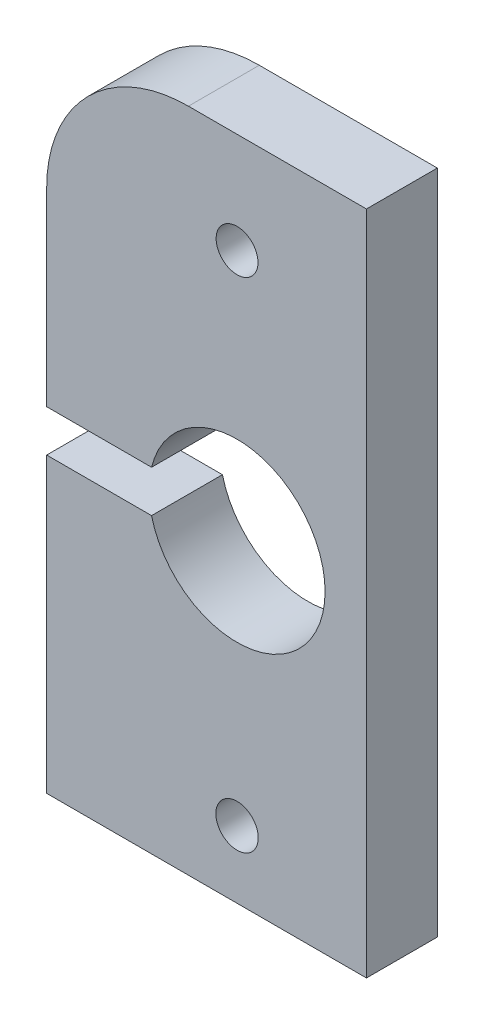
ISO-10303-21;
HEADER;
FILE_DESCRIPTION(('STEP AP214'),'2;1');
FILE_NAME('part.step','',(''),(''),'','','');
FILE_SCHEMA(('AUTOMOTIVE_DESIGN { 1 0 10303 214 1 1 1 1 }'));
ENDSEC;
DATA;
#1=APPLICATION_CONTEXT('core data for automotive mechanical design processes');
#2=APPLICATION_PROTOCOL_DEFINITION('international standard','automotive_design',2000,#1);
#3=PRODUCT_CONTEXT('',#1,'mechanical');
#4=PRODUCT('Part','Part','',(#3));
#5=PRODUCT_RELATED_PRODUCT_CATEGORY('part','',(#4));
#6=PRODUCT_DEFINITION_FORMATION('','',#4);
#7=PRODUCT_DEFINITION_CONTEXT('part definition',#1,'design');
#8=PRODUCT_DEFINITION('design','',#6,#7);
#9=PRODUCT_DEFINITION_SHAPE('','',#8);
#10=(LENGTH_UNIT() NAMED_UNIT(*) SI_UNIT(.MILLI.,.METRE.));
#11=(NAMED_UNIT(*) PLANE_ANGLE_UNIT() SI_UNIT($,.RADIAN.));
#12=(NAMED_UNIT(*) SI_UNIT($,.STERADIAN.) SOLID_ANGLE_UNIT());
#13=UNCERTAINTY_MEASURE_WITH_UNIT(LENGTH_MEASURE(1.E-05),#10,'distance_accuracy_value','');
#14=(GEOMETRIC_REPRESENTATION_CONTEXT(3) GLOBAL_UNCERTAINTY_ASSIGNED_CONTEXT((#13)) GLOBAL_UNIT_ASSIGNED_CONTEXT((#10,
#11,#12)) REPRESENTATION_CONTEXT('',''));
#15=CARTESIAN_POINT('',(0.,0.,0.));
#16=DIRECTION('',(0.,0.,1.));
#17=DIRECTION('',(1.,0.,0.));
#18=AXIS2_PLACEMENT_3D('',#15,#16,#17);
#19=CARTESIAN_POINT('',(-103.635582515292,86.8287381906903,5.08));
#20=DIRECTION('',(0.,0.,-1.));
#21=DIRECTION('',(-1.,0.,0.));
#22=AXIS2_PLACEMENT_3D('',#19,#20,#21);
#23=CYLINDRICAL_SURFACE('',#22,6.30892038834635);
#24=CARTESIAN_POINT('',(-103.635582515292,86.8287381906903,0.));
#25=DIRECTION('',(0.,0.,1.));
#26=DIRECTION('',(1.,0.,0.));
#27=AXIS2_PLACEMENT_3D('',#24,#25,#26);
#28=CIRCLE('',#27,6.30892038834635);
#29=CARTESIAN_POINT('',(-109.763590059877,85.3287381906903,0.));
#30=VERTEX_POINT('',#29);
#31=CARTESIAN_POINT('',(-109.763590059877,88.3287381906903,0.));
#32=VERTEX_POINT('',#31);
#33=EDGE_CURVE('E139',#30,#32,#28,.T.);
#34=ORIENTED_EDGE('',*,*,#33,.F.);
#35=DIRECTION('',(0.,0.,-1.));
#36=VECTOR('',#35,1.);
#37=CARTESIAN_POINT('',(-109.763590059877,85.3287381906903,5.08));
#38=LINE('',#37,#36);
#39=CARTESIAN_POINT('',(-109.763590059877,85.3287381906903,5.08));
#40=VERTEX_POINT('',#39);
#41=EDGE_CURVE('E11',#40,#30,#38,.T.);
#42=ORIENTED_EDGE('',*,*,#41,.F.);
#43=CARTESIAN_POINT('',(-103.635582515292,86.8287381906903,5.08));
#44=DIRECTION('',(0.,0.,1.));
#45=DIRECTION('',(1.,0.,0.));
#46=AXIS2_PLACEMENT_3D('',#43,#44,#45);
#47=CIRCLE('',#46,6.30892038834635);
#48=CARTESIAN_POINT('',(-109.763590059877,88.3287381906903,5.08));
#49=VERTEX_POINT('',#48);
#50=EDGE_CURVE('E168',#40,#49,#47,.T.);
#51=ORIENTED_EDGE('',*,*,#50,.T.);
#52=DIRECTION('',(0.,0.,-1.));
#53=VECTOR('',#52,1.);
#54=CARTESIAN_POINT('',(-109.763590059877,88.3287381906903,5.08));
#55=LINE('',#54,#53);
#56=EDGE_CURVE('E49',#49,#32,#55,.T.);
#57=ORIENTED_EDGE('',*,*,#56,.T.);
#58=EDGE_LOOP('',(#34,#42,#51,#57));
#59=FACE_BOUND('',#58,.T.);
#60=ADVANCED_FACE('F33',(#59),#23,.F.);
#61=CARTESIAN_POINT('',(0.,85.3287381906903,5.08));
#62=DIRECTION('',(0.,1.,0.));
#63=DIRECTION('',(0.,0.,1.));
#64=AXIS2_PLACEMENT_3D('',#61,#62,#63);
#65=PLANE('',#64);
#66=DIRECTION('',(1.,0.,0.));
#67=VECTOR('',#66,1.);
#68=CARTESIAN_POINT('',(0.,85.3287381906903,0.));
#69=LINE('',#68,#67);
#70=CARTESIAN_POINT('',(-117.281412130556,85.3287381906903,0.));
#71=VERTEX_POINT('',#70);
#72=EDGE_CURVE('E141',#71,#30,#69,.T.);
#73=ORIENTED_EDGE('',*,*,#72,.F.);
#74=DIRECTION('',(0.,0.,-1.));
#75=VECTOR('',#74,1.);
#76=CARTESIAN_POINT('',(-117.281412130556,85.3287381906903,5.08));
#77=LINE('',#76,#75);
#78=CARTESIAN_POINT('',(-117.281412130556,85.3287381906903,5.08));
#79=VERTEX_POINT('',#78);
#80=EDGE_CURVE('E41',#79,#71,#77,.T.);
#81=ORIENTED_EDGE('',*,*,#80,.F.);
#82=DIRECTION('',(1.,0.,0.));
#83=VECTOR('',#82,1.);
#84=CARTESIAN_POINT('',(0.,85.3287381906903,5.08));
#85=LINE('',#84,#83);
#86=EDGE_CURVE('E199',#79,#40,#85,.T.);
#87=ORIENTED_EDGE('',*,*,#86,.T.);
#88=ORIENTED_EDGE('',*,*,#41,.T.);
#89=EDGE_LOOP('',(#73,#81,#87,#88));
#90=FACE_BOUND('',#89,.T.);
#91=ADVANCED_FACE('F187',(#90),#65,.T.);
#92=CARTESIAN_POINT('',(-117.281412130556,-1.00755895091466E-12,5.08));
#93=DIRECTION('',(-1.,0.,0.));
#94=DIRECTION('',(0.,-1.,0.));
#95=AXIS2_PLACEMENT_3D('',#92,#93,#94);
#96=PLANE('',#95);
#97=DIRECTION('',(0.,1.,0.));
#98=VECTOR('',#97,1.);
#99=CARTESIAN_POINT('',(-117.281412130556,-1.00755895091466E-12,0.));
#100=LINE('',#99,#98);
#101=CARTESIAN_POINT('',(-117.281412130556,64.3285920966825,0.));
#102=VERTEX_POINT('',#101);
#103=EDGE_CURVE('E144',#102,#71,#100,.T.);
#104=ORIENTED_EDGE('',*,*,#103,.F.);
#105=DIRECTION('',(0.,0.,-1.));
#106=VECTOR('',#105,1.);
#107=CARTESIAN_POINT('',(-117.281412130556,64.3285920966825,5.08));
#108=LINE('',#107,#106);
#109=CARTESIAN_POINT('',(-117.281412130556,64.3285920966825,5.08));
#110=VERTEX_POINT('',#109);
#111=EDGE_CURVE('E176',#110,#102,#108,.T.);
#112=ORIENTED_EDGE('',*,*,#111,.F.);
#113=DIRECTION('',(0.,1.,0.));
#114=VECTOR('',#113,1.);
#115=CARTESIAN_POINT('',(-117.281412130556,-1.00755895091466E-12,5.08));
#116=LINE('',#115,#114);
#117=EDGE_CURVE('E183',#110,#79,#116,.T.);
#118=ORIENTED_EDGE('',*,*,#117,.T.);
#119=ORIENTED_EDGE('',*,*,#80,.T.);
#120=EDGE_LOOP('',(#104,#112,#118,#119));
#121=FACE_BOUND('',#120,.T.);
#122=ADVANCED_FACE('F181',(#121),#96,.T.);
#123=CARTESIAN_POINT('',(0.,64.3285920966825,5.08));
#124=DIRECTION('',(0.,-1.,0.));
#125=DIRECTION('',(0.,0.,-1.));
#126=AXIS2_PLACEMENT_3D('',#123,#124,#125);
#127=PLANE('',#126);
#128=DIRECTION('',(-1.,0.,0.));
#129=VECTOR('',#128,1.);
#130=CARTESIAN_POINT('',(0.,64.3285920966825,0.));
#131=LINE('',#130,#129);
#132=CARTESIAN_POINT('',(-94.3616745850101,64.3285920966825,0.));
#133=VERTEX_POINT('',#132);
#134=EDGE_CURVE('E147',#133,#102,#131,.T.);
#135=ORIENTED_EDGE('',*,*,#134,.F.);
#136=DIRECTION('',(0.,0.,-1.));
#137=VECTOR('',#136,1.);
#138=CARTESIAN_POINT('',(-94.3616745850101,64.3285920966825,5.08));
#139=LINE('',#138,#137);
#140=CARTESIAN_POINT('',(-94.3616745850101,64.3285920966825,5.08));
#141=VERTEX_POINT('',#140);
#142=EDGE_CURVE('E174',#141,#133,#139,.T.);
#143=ORIENTED_EDGE('',*,*,#142,.F.);
#144=DIRECTION('',(-1.,0.,0.));
#145=VECTOR('',#144,1.);
#146=CARTESIAN_POINT('',(0.,64.3285920966825,5.08));
#147=LINE('',#146,#145);
#148=EDGE_CURVE('E197',#141,#110,#147,.T.);
#149=ORIENTED_EDGE('',*,*,#148,.T.);
#150=ORIENTED_EDGE('',*,*,#111,.T.);
#151=EDGE_LOOP('',(#135,#143,#149,#150));
#152=FACE_BOUND('',#151,.T.);
#153=ADVANCED_FACE('F194',(#152),#127,.T.);
#154=CARTESIAN_POINT('',(-94.3616745850101,0.,5.08));
#155=DIRECTION('',(1.,0.,0.));
#156=DIRECTION('',(0.,0.,-1.));
#157=AXIS2_PLACEMENT_3D('',#154,#155,#156);
#158=PLANE('',#157);
#159=DIRECTION('',(0.,-1.,0.));
#160=VECTOR('',#159,1.);
#161=CARTESIAN_POINT('',(-94.3616745850101,0.,0.));
#162=LINE('',#161,#160);
#163=CARTESIAN_POINT('',(-94.3616745850101,112.062374012965,0.));
#164=VERTEX_POINT('',#163);
#165=EDGE_CURVE('E150',#164,#133,#162,.T.);
#166=ORIENTED_EDGE('',*,*,#165,.F.);
#167=DIRECTION('',(0.,0.,-1.));
#168=VECTOR('',#167,1.);
#169=CARTESIAN_POINT('',(-94.3616745850101,112.062374012965,5.08));
#170=LINE('',#169,#168);
#171=CARTESIAN_POINT('',(-94.3616745850101,112.062374012965,5.08));
#172=VERTEX_POINT('',#171);
#173=EDGE_CURVE('E172',#172,#164,#170,.T.);
#174=ORIENTED_EDGE('',*,*,#173,.F.);
#175=DIRECTION('',(0.,-1.,0.));
#176=VECTOR('',#175,1.);
#177=CARTESIAN_POINT('',(-94.3616745850101,0.,5.08));
#178=LINE('',#177,#176);
#179=EDGE_CURVE('E201',#172,#141,#178,.T.);
#180=ORIENTED_EDGE('',*,*,#179,.T.);
#181=ORIENTED_EDGE('',*,*,#142,.T.);
#182=EDGE_LOOP('',(#166,#174,#180,#181));
#183=FACE_BOUND('',#182,.T.);
#184=ADVANCED_FACE('F234',(#183),#158,.T.);
#185=CARTESIAN_POINT('',(2.43763297205831E-13,112.062374012965,5.08));
#186=DIRECTION('',(0.,1.,0.));
#187=DIRECTION('',(-1.,0.,0.));
#188=AXIS2_PLACEMENT_3D('',#185,#186,#187);
#189=PLANE('',#188);
#190=DIRECTION('',(1.,0.,0.));
#191=VECTOR('',#190,1.);
#192=CARTESIAN_POINT('',(2.43763297205831E-13,112.062374012965,0.));
#193=LINE('',#192,#191);
#194=CARTESIAN_POINT('',(-107.121412130558,112.062374012965,0.));
#195=VERTEX_POINT('',#194);
#196=EDGE_CURVE('E153',#195,#164,#193,.T.);
#197=ORIENTED_EDGE('',*,*,#196,.F.);
#198=DIRECTION('',(0.,0.,-1.));
#199=VECTOR('',#198,1.);
#200=CARTESIAN_POINT('',(-107.121412130558,112.062374012965,5.08));
#201=LINE('',#200,#199);
#202=CARTESIAN_POINT('',(-107.121412130558,112.062374012965,5.08));
#203=VERTEX_POINT('',#202);
#204=EDGE_CURVE('E114',#203,#195,#201,.T.);
#205=ORIENTED_EDGE('',*,*,#204,.F.);
#206=DIRECTION('',(1.,0.,0.));
#207=VECTOR('',#206,1.);
#208=CARTESIAN_POINT('',(2.43763297205831E-13,112.062374012965,5.08));
#209=LINE('',#208,#207);
#210=EDGE_CURVE('E125',#203,#172,#209,.T.);
#211=ORIENTED_EDGE('',*,*,#210,.T.);
#212=ORIENTED_EDGE('',*,*,#173,.T.);
#213=EDGE_LOOP('',(#197,#205,#211,#212));
#214=FACE_BOUND('',#213,.T.);
#215=ADVANCED_FACE('F208',(#214),#189,.T.);
#216=CARTESIAN_POINT('',(-107.121412130557,101.902374012965,5.08));
#217=DIRECTION('',(0.,0.,-1.));
#218=DIRECTION('',(-1.,0.,0.));
#219=AXIS2_PLACEMENT_3D('',#216,#217,#218);
#220=CYLINDRICAL_SURFACE('',#219,10.16);
#221=CARTESIAN_POINT('',(-107.121412130557,101.902374012965,0.));
#222=DIRECTION('',(0.,0.,1.));
#223=DIRECTION('',(1.,0.,0.));
#224=AXIS2_PLACEMENT_3D('',#221,#222,#223);
#225=CIRCLE('',#224,10.16);
#226=CARTESIAN_POINT('',(-117.281412130557,101.902374012965,0.));
#227=VERTEX_POINT('',#226);
#228=EDGE_CURVE('E110',#227,#195,#225,.F.);
#229=ORIENTED_EDGE('',*,*,#228,.F.);
#230=DIRECTION('',(0.,0.,-1.));
#231=VECTOR('',#230,1.);
#232=CARTESIAN_POINT('',(-117.281412130557,101.902374012965,5.08));
#233=LINE('',#232,#231);
#234=CARTESIAN_POINT('',(-117.281412130557,101.902374012965,5.08));
#235=VERTEX_POINT('',#234);
#236=EDGE_CURVE('E105',#235,#227,#233,.T.);
#237=ORIENTED_EDGE('',*,*,#236,.F.);
#238=CARTESIAN_POINT('',(-107.121412130557,101.902374012965,5.08));
#239=DIRECTION('',(0.,0.,1.));
#240=DIRECTION('',(1.,0.,0.));
#241=AXIS2_PLACEMENT_3D('',#238,#239,#240);
#242=CIRCLE('',#241,10.16);
#243=EDGE_CURVE('E108',#235,#203,#242,.F.);
#244=ORIENTED_EDGE('',*,*,#243,.T.);
#245=ORIENTED_EDGE('',*,*,#204,.T.);
#246=EDGE_LOOP('',(#229,#237,#244,#245));
#247=FACE_BOUND('',#246,.T.);
#248=ADVANCED_FACE('F107',(#247),#220,.T.);
#249=CARTESIAN_POINT('',(-117.281412130556,-9.59275214192937E-13,5.08));
#250=DIRECTION('',(-1.,0.,0.));
#251=DIRECTION('',(0.,-1.,0.));
#252=AXIS2_PLACEMENT_3D('',#249,#250,#251);
#253=PLANE('',#252);
#254=DIRECTION('',(0.,1.,0.));
#255=VECTOR('',#254,1.);
#256=CARTESIAN_POINT('',(-117.281412130556,-9.59275214192937E-13,0.));
#257=LINE('',#256,#255);
#258=CARTESIAN_POINT('',(-117.281412130556,88.3287381906903,0.));
#259=VERTEX_POINT('',#258);
#260=EDGE_CURVE('E157',#259,#227,#257,.T.);
#261=ORIENTED_EDGE('',*,*,#260,.F.);
#262=DIRECTION('',(0.,0.,-1.));
#263=VECTOR('',#262,1.);
#264=CARTESIAN_POINT('',(-117.281412130556,88.3287381906903,5.08));
#265=LINE('',#264,#263);
#266=CARTESIAN_POINT('',(-117.281412130556,88.3287381906903,5.08));
#267=VERTEX_POINT('',#266);
#268=EDGE_CURVE('E77',#267,#259,#265,.T.);
#269=ORIENTED_EDGE('',*,*,#268,.F.);
#270=DIRECTION('',(0.,1.,0.));
#271=VECTOR('',#270,1.);
#272=CARTESIAN_POINT('',(-117.281412130556,-9.59275214192937E-13,5.08));
#273=LINE('',#272,#271);
#274=EDGE_CURVE('E122',#267,#235,#273,.T.);
#275=ORIENTED_EDGE('',*,*,#274,.T.);
#276=ORIENTED_EDGE('',*,*,#236,.T.);
#277=EDGE_LOOP('',(#261,#269,#275,#276));
#278=FACE_BOUND('',#277,.T.);
#279=ADVANCED_FACE('F127',(#278),#253,.T.);
#280=CARTESIAN_POINT('',(-103.635582515292,69.1404876925652,5.08));
#281=DIRECTION('',(0.,0.,-1.));
#282=DIRECTION('',(-1.,0.,0.));
#283=AXIS2_PLACEMENT_3D('',#280,#281,#282);
#284=CYLINDRICAL_SURFACE('',#283,1.51791338852264);
#285=CARTESIAN_POINT('',(-103.635582515292,69.1404876925652,5.08));
#286=DIRECTION('',(0.,0.,1.));
#287=DIRECTION('',(1.,0.,0.));
#288=AXIS2_PLACEMENT_3D('',#285,#286,#287);
#289=CIRCLE('',#288,1.51791338852264);
#290=CARTESIAN_POINT('',(-102.11766912677,69.1404876925652,5.08));
#291=VERTEX_POINT('',#290);
#292=EDGE_CURVE('E130',#291,#291,#289,.T.);
#293=ORIENTED_EDGE('',*,*,#292,.T.);
#294=EDGE_LOOP('',(#293));
#295=FACE_BOUND('',#294,.T.);
#296=CARTESIAN_POINT('',(-103.635582515292,69.1404876925652,0.));
#297=DIRECTION('',(0.,0.,1.));
#298=DIRECTION('',(1.,0.,0.));
#299=AXIS2_PLACEMENT_3D('',#296,#297,#298);
#300=CIRCLE('',#299,1.51791338852264);
#301=CARTESIAN_POINT('',(-102.11766912677,69.1404876925652,0.));
#302=VERTEX_POINT('',#301);
#303=EDGE_CURVE('E162',#302,#302,#300,.T.);
#304=ORIENTED_EDGE('',*,*,#303,.F.);
#305=EDGE_LOOP('',(#304));
#306=FACE_BOUND('',#305,.T.);
#307=ADVANCED_FACE('F212',(#295,#306),#284,.F.);
#308=CARTESIAN_POINT('',(0.,88.3287381906903,5.08));
#309=DIRECTION('',(0.,-1.,0.));
#310=DIRECTION('',(0.,0.,-1.));
#311=AXIS2_PLACEMENT_3D('',#308,#309,#310);
#312=PLANE('',#311);
#313=DIRECTION('',(-1.,0.,0.));
#314=VECTOR('',#313,1.);
#315=CARTESIAN_POINT('',(0.,88.3287381906903,0.));
#316=LINE('',#315,#314);
#317=EDGE_CURVE('E159',#32,#259,#316,.T.);
#318=ORIENTED_EDGE('',*,*,#317,.F.);
#319=ORIENTED_EDGE('',*,*,#56,.F.);
#320=DIRECTION('',(-1.,0.,0.));
#321=VECTOR('',#320,1.);
#322=CARTESIAN_POINT('',(0.,88.3287381906903,5.08));
#323=LINE('',#322,#321);
#324=EDGE_CURVE('E128',#49,#267,#323,.T.);
#325=ORIENTED_EDGE('',*,*,#324,.T.);
#326=ORIENTED_EDGE('',*,*,#268,.T.);
#327=EDGE_LOOP('',(#318,#319,#325,#326));
#328=FACE_BOUND('',#327,.T.);
#329=ADVANCED_FACE('F209',(#328),#312,.T.);
#330=CARTESIAN_POINT('',(-103.635582515292,104.844491411556,5.08));
#331=DIRECTION('',(0.,0.,-1.));
#332=DIRECTION('',(-1.,0.,0.));
#333=AXIS2_PLACEMENT_3D('',#330,#331,#332);
#334=CYLINDRICAL_SURFACE('',#333,1.5);
#335=CARTESIAN_POINT('',(-103.635582515292,104.844491411556,5.08));
#336=DIRECTION('',(0.,0.,1.));
#337=DIRECTION('',(1.,0.,0.));
#338=AXIS2_PLACEMENT_3D('',#335,#336,#337);
#339=CIRCLE('',#338,1.5);
#340=CARTESIAN_POINT('',(-102.135582515292,104.844491411556,5.08));
#341=VERTEX_POINT('',#340);
#342=EDGE_CURVE('E136',#341,#341,#339,.T.);
#343=ORIENTED_EDGE('',*,*,#342,.T.);
#344=EDGE_LOOP('',(#343));
#345=FACE_BOUND('',#344,.T.);
#346=CARTESIAN_POINT('',(-103.635582515292,104.844491411556,0.));
#347=DIRECTION('',(0.,0.,1.));
#348=DIRECTION('',(1.,0.,0.));
#349=AXIS2_PLACEMENT_3D('',#346,#347,#348);
#350=CIRCLE('',#349,1.5);
#351=CARTESIAN_POINT('',(-102.135582515292,104.844491411556,0.));
#352=VERTEX_POINT('',#351);
#353=EDGE_CURVE('E165',#352,#352,#350,.T.);
#354=ORIENTED_EDGE('',*,*,#353,.F.);
#355=EDGE_LOOP('',(#354));
#356=FACE_BOUND('',#355,.T.);
#357=ADVANCED_FACE('F211',(#345,#356),#334,.F.);
#358=CARTESIAN_POINT('',(0.,0.,5.08));
#359=DIRECTION('',(0.,0.,1.));
#360=DIRECTION('',(1.,0.,0.));
#361=AXIS2_PLACEMENT_3D('',#358,#359,#360);
#362=PLANE('',#361);
#363=ORIENTED_EDGE('',*,*,#50,.F.);
#364=ORIENTED_EDGE('',*,*,#86,.F.);
#365=ORIENTED_EDGE('',*,*,#117,.F.);
#366=ORIENTED_EDGE('',*,*,#148,.F.);
#367=ORIENTED_EDGE('',*,*,#179,.F.);
#368=ORIENTED_EDGE('',*,*,#210,.F.);
#369=ORIENTED_EDGE('',*,*,#243,.F.);
#370=ORIENTED_EDGE('',*,*,#274,.F.);
#371=ORIENTED_EDGE('',*,*,#324,.F.);
#372=EDGE_LOOP('',(#363,#364,#365,#366,#367,#368,#369,#370,#371));
#373=FACE_BOUND('',#372,.T.);
#374=ORIENTED_EDGE('',*,*,#292,.F.);
#375=EDGE_LOOP('',(#374));
#376=FACE_BOUND('',#375,.T.);
#377=ORIENTED_EDGE('',*,*,#342,.F.);
#378=EDGE_LOOP('',(#377));
#379=FACE_BOUND('',#378,.T.);
#380=ADVANCED_FACE('F119',(#373,#376,#379),#362,.T.);
#381=CARTESIAN_POINT('',(0.,0.,0.));
#382=DIRECTION('',(0.,0.,1.));
#383=DIRECTION('',(1.,0.,0.));
#384=AXIS2_PLACEMENT_3D('',#381,#382,#383);
#385=PLANE('',#384);
#386=ORIENTED_EDGE('',*,*,#33,.T.);
#387=ORIENTED_EDGE('',*,*,#317,.T.);
#388=ORIENTED_EDGE('',*,*,#260,.T.);
#389=ORIENTED_EDGE('',*,*,#228,.T.);
#390=ORIENTED_EDGE('',*,*,#196,.T.);
#391=ORIENTED_EDGE('',*,*,#165,.T.);
#392=ORIENTED_EDGE('',*,*,#134,.T.);
#393=ORIENTED_EDGE('',*,*,#103,.T.);
#394=ORIENTED_EDGE('',*,*,#72,.T.);
#395=EDGE_LOOP('',(#386,#387,#388,#389,#390,#391,#392,#393,#394));
#396=FACE_BOUND('',#395,.T.);
#397=ORIENTED_EDGE('',*,*,#303,.T.);
#398=EDGE_LOOP('',(#397));
#399=FACE_BOUND('',#398,.T.);
#400=ORIENTED_EDGE('',*,*,#353,.T.);
#401=EDGE_LOOP('',(#400));
#402=FACE_BOUND('',#401,.T.);
#403=ADVANCED_FACE('F189',(#396,#399,#402),#385,.F.);
#404=CLOSED_SHELL('',(#60,#91,#122,#153,#184,#215,#248,#279,#307,#329,#357,#380,#403));
#405=MANIFOLD_SOLID_BREP('B2',#404);
#406=ADVANCED_BREP_SHAPE_REPRESENTATION('',(#18,#405),#14);
#407=SHAPE_DEFINITION_REPRESENTATION(#9,#406);
ENDSEC;
END-ISO-10303-21;
